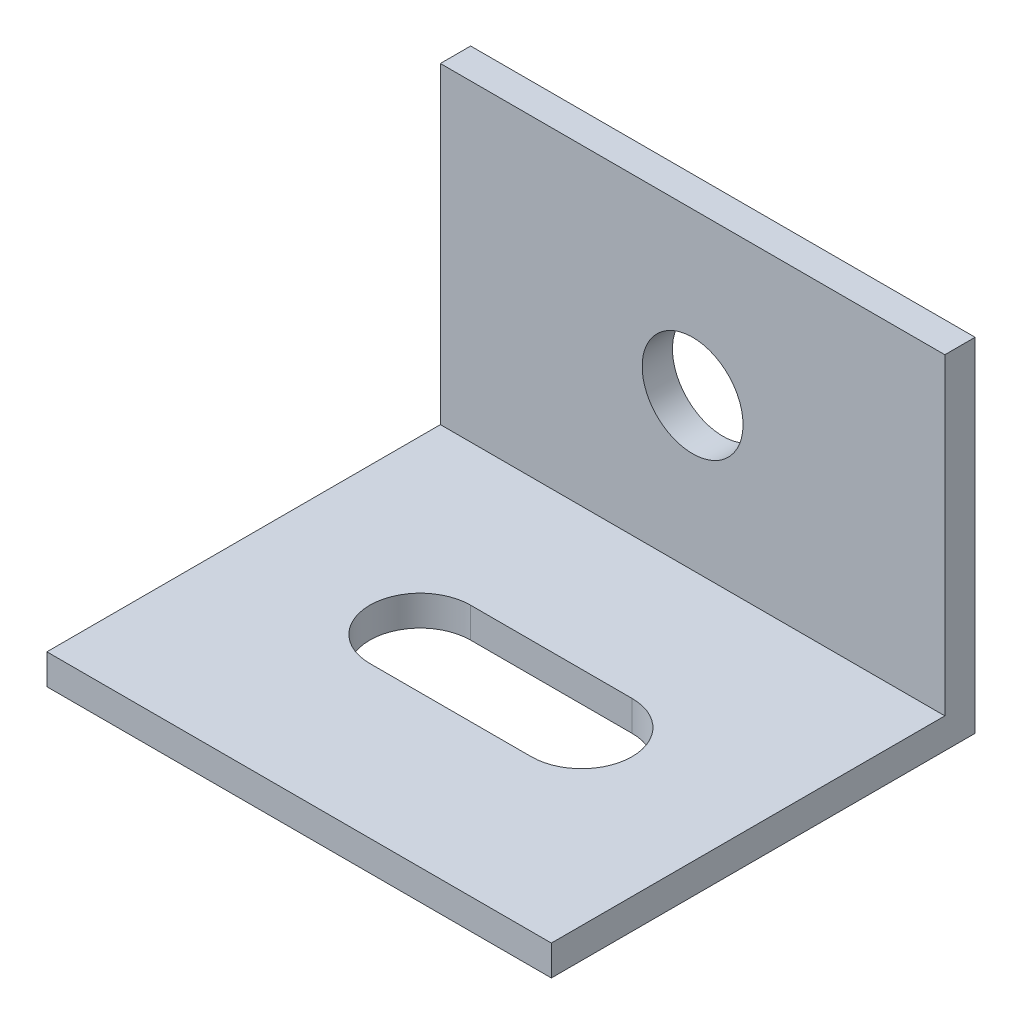
ISO-10303-21;
HEADER;
FILE_DESCRIPTION(('STEP AP214'),'2;1');
FILE_NAME('part.step','',(''),(''),'','','');
FILE_SCHEMA(('AUTOMOTIVE_DESIGN { 1 0 10303 214 1 1 1 1 }'));
ENDSEC;
DATA;
#1=APPLICATION_CONTEXT('core data for automotive mechanical design processes');
#2=APPLICATION_PROTOCOL_DEFINITION('international standard','automotive_design',2000,#1);
#3=PRODUCT_CONTEXT('',#1,'mechanical');
#4=PRODUCT('Part','Part','',(#3));
#5=PRODUCT_RELATED_PRODUCT_CATEGORY('part','',(#4));
#6=PRODUCT_DEFINITION_FORMATION('','',#4);
#7=PRODUCT_DEFINITION_CONTEXT('part definition',#1,'design');
#8=PRODUCT_DEFINITION('design','',#6,#7);
#9=PRODUCT_DEFINITION_SHAPE('','',#8);
#10=(LENGTH_UNIT() NAMED_UNIT(*) SI_UNIT(.MILLI.,.METRE.));
#11=(NAMED_UNIT(*) PLANE_ANGLE_UNIT() SI_UNIT($,.RADIAN.));
#12=(NAMED_UNIT(*) SI_UNIT($,.STERADIAN.) SOLID_ANGLE_UNIT());
#13=UNCERTAINTY_MEASURE_WITH_UNIT(LENGTH_MEASURE(1.E-05),#10,'distance_accuracy_value','');
#14=(GEOMETRIC_REPRESENTATION_CONTEXT(3) GLOBAL_UNCERTAINTY_ASSIGNED_CONTEXT((#13)) GLOBAL_UNIT_ASSIGNED_CONTEXT((#10,
#11,#12)) REPRESENTATION_CONTEXT('',''));
#15=CARTESIAN_POINT('',(0.,0.,0.));
#16=DIRECTION('',(0.,0.,1.));
#17=DIRECTION('',(1.,0.,0.));
#18=AXIS2_PLACEMENT_3D('',#15,#16,#17);
#19=CARTESIAN_POINT('',(0.,0.,1.5));
#20=DIRECTION('',(0.,0.,-1.));
#21=DIRECTION('',(-1.,0.,0.));
#22=AXIS2_PLACEMENT_3D('',#19,#20,#21);
#23=PLANE('',#22);
#24=CARTESIAN_POINT('',(12.5,9.,1.5));
#25=DIRECTION('',(0.,0.,1.));
#26=DIRECTION('',(1.,0.,0.));
#27=AXIS2_PLACEMENT_3D('',#24,#25,#26);
#28=CIRCLE('',#27,2.5);
#29=CARTESIAN_POINT('',(15.,9.,1.5));
#30=VERTEX_POINT('',#29);
#31=EDGE_CURVE('E167',#30,#30,#28,.T.);
#32=ORIENTED_EDGE('',*,*,#31,.F.);
#33=EDGE_LOOP('',(#32));
#34=FACE_BOUND('',#33,.T.);
#35=DIRECTION('',(-1.,0.,0.));
#36=VECTOR('',#35,1.);
#37=CARTESIAN_POINT('',(0.,1.5,1.5));
#38=LINE('',#37,#36);
#39=CARTESIAN_POINT('',(25.,1.5,1.5));
#40=VERTEX_POINT('',#39);
#41=CARTESIAN_POINT('',(0.,1.5,1.5));
#42=VERTEX_POINT('',#41);
#43=EDGE_CURVE('E147',#40,#42,#38,.T.);
#44=ORIENTED_EDGE('',*,*,#43,.F.);
#45=DIRECTION('',(0.,1.,0.));
#46=VECTOR('',#45,1.);
#47=CARTESIAN_POINT('',(25.,0.,1.5));
#48=LINE('',#47,#46);
#49=CARTESIAN_POINT('',(25.,17.,1.5));
#50=VERTEX_POINT('',#49);
#51=EDGE_CURVE('E175',#40,#50,#48,.T.);
#52=ORIENTED_EDGE('',*,*,#51,.T.);
#53=DIRECTION('',(-1.,0.,0.));
#54=VECTOR('',#53,1.);
#55=CARTESIAN_POINT('',(0.,17.,1.5));
#56=LINE('',#55,#54);
#57=CARTESIAN_POINT('',(0.,17.,1.5));
#58=VERTEX_POINT('',#57);
#59=EDGE_CURVE('E178',#50,#58,#56,.T.);
#60=ORIENTED_EDGE('',*,*,#59,.T.);
#61=DIRECTION('',(0.,-1.,0.));
#62=VECTOR('',#61,1.);
#63=CARTESIAN_POINT('',(0.,0.,1.5));
#64=LINE('',#63,#62);
#65=EDGE_CURVE('E173',#58,#42,#64,.T.);
#66=ORIENTED_EDGE('',*,*,#65,.T.);
#67=EDGE_LOOP('',(#44,#52,#60,#66));
#68=FACE_BOUND('',#67,.T.);
#69=ADVANCED_FACE('F33',(#34,#68),#23,.F.);
#70=CARTESIAN_POINT('',(0.,0.,0.));
#71=DIRECTION('',(0.,0.,-1.));
#72=DIRECTION('',(-1.,0.,0.));
#73=AXIS2_PLACEMENT_3D('',#70,#71,#72);
#74=PLANE('',#73);
#75=DIRECTION('',(0.,-1.,0.));
#76=VECTOR('',#75,1.);
#77=CARTESIAN_POINT('',(0.,0.,0.));
#78=LINE('',#77,#76);
#79=CARTESIAN_POINT('',(0.,17.,0.));
#80=VERTEX_POINT('',#79);
#81=CARTESIAN_POINT('',(0.,0.,0.));
#82=VERTEX_POINT('',#81);
#83=EDGE_CURVE('E170',#80,#82,#78,.T.);
#84=ORIENTED_EDGE('',*,*,#83,.F.);
#85=DIRECTION('',(-1.,0.,0.));
#86=VECTOR('',#85,1.);
#87=CARTESIAN_POINT('',(0.,17.,0.));
#88=LINE('',#87,#86);
#89=CARTESIAN_POINT('',(25.,17.,0.));
#90=VERTEX_POINT('',#89);
#91=EDGE_CURVE('E176',#90,#80,#88,.T.);
#92=ORIENTED_EDGE('',*,*,#91,.F.);
#93=DIRECTION('',(0.,1.,0.));
#94=VECTOR('',#93,1.);
#95=CARTESIAN_POINT('',(25.,0.,0.));
#96=LINE('',#95,#94);
#97=CARTESIAN_POINT('',(25.,0.,0.));
#98=VERTEX_POINT('',#97);
#99=EDGE_CURVE('E185',#98,#90,#96,.T.);
#100=ORIENTED_EDGE('',*,*,#99,.F.);
#101=DIRECTION('',(1.,0.,0.));
#102=VECTOR('',#101,1.);
#103=CARTESIAN_POINT('',(0.,0.,0.));
#104=LINE('',#103,#102);
#105=EDGE_CURVE('E183',#82,#98,#104,.T.);
#106=ORIENTED_EDGE('',*,*,#105,.F.);
#107=EDGE_LOOP('',(#84,#92,#100,#106));
#108=FACE_BOUND('',#107,.T.);
#109=CARTESIAN_POINT('',(12.5,9.,0.));
#110=DIRECTION('',(0.,0.,1.));
#111=DIRECTION('',(1.,0.,0.));
#112=AXIS2_PLACEMENT_3D('',#109,#110,#111);
#113=CIRCLE('',#112,2.5);
#114=CARTESIAN_POINT('',(15.,9.,0.));
#115=VERTEX_POINT('',#114);
#116=EDGE_CURVE('E166',#115,#115,#113,.T.);
#117=ORIENTED_EDGE('',*,*,#116,.T.);
#118=EDGE_LOOP('',(#117));
#119=FACE_BOUND('',#118,.T.);
#120=ADVANCED_FACE('F204',(#108,#119),#74,.T.);
#121=CARTESIAN_POINT('',(0.,0.,1.5));
#122=DIRECTION('',(1.,0.,0.));
#123=DIRECTION('',(0.,0.,-1.));
#124=AXIS2_PLACEMENT_3D('',#121,#122,#123);
#125=PLANE('',#124);
#126=ORIENTED_EDGE('',*,*,#83,.T.);
#127=DIRECTION('',(0.,0.,-1.));
#128=VECTOR('',#127,1.);
#129=CARTESIAN_POINT('',(0.,0.,1.5));
#130=LINE('',#129,#128);
#131=CARTESIAN_POINT('',(0.,0.,21.));
#132=VERTEX_POINT('',#131);
#133=EDGE_CURVE('E11',#132,#82,#130,.T.);
#134=ORIENTED_EDGE('',*,*,#133,.F.);
#135=DIRECTION('',(0.,-1.,0.));
#136=VECTOR('',#135,1.);
#137=CARTESIAN_POINT('',(0.,0.,21.));
#138=LINE('',#137,#136);
#139=CARTESIAN_POINT('',(0.,1.5,21.));
#140=VERTEX_POINT('',#139);
#141=EDGE_CURVE('E148',#140,#132,#138,.T.);
#142=ORIENTED_EDGE('',*,*,#141,.F.);
#143=DIRECTION('',(0.,0.,-1.));
#144=VECTOR('',#143,1.);
#145=CARTESIAN_POINT('',(0.,1.5,21.));
#146=LINE('',#145,#144);
#147=EDGE_CURVE('E158',#140,#42,#146,.T.);
#148=ORIENTED_EDGE('',*,*,#147,.T.);
#149=ORIENTED_EDGE('',*,*,#65,.F.);
#150=DIRECTION('',(0.,0.,-1.));
#151=VECTOR('',#150,1.);
#152=CARTESIAN_POINT('',(0.,17.,1.5));
#153=LINE('',#152,#151);
#154=EDGE_CURVE('E180',#58,#80,#153,.T.);
#155=ORIENTED_EDGE('',*,*,#154,.T.);
#156=EDGE_LOOP('',(#126,#134,#142,#148,#149,#155));
#157=FACE_BOUND('',#156,.T.);
#158=ADVANCED_FACE('F35',(#157),#125,.F.);
#159=CARTESIAN_POINT('',(0.,0.,1.5));
#160=DIRECTION('',(0.,1.,0.));
#161=DIRECTION('',(0.,0.,1.));
#162=AXIS2_PLACEMENT_3D('',#159,#160,#161);
#163=PLANE('',#162);
#164=DIRECTION('',(-1.,0.,0.));
#165=VECTOR('',#164,1.);
#166=CARTESIAN_POINT('',(0.,0.,8.5));
#167=LINE('',#166,#165);
#168=CARTESIAN_POINT('',(16.5,0.,8.5));
#169=VERTEX_POINT('',#168);
#170=CARTESIAN_POINT('',(8.5,0.,8.5));
#171=VERTEX_POINT('',#170);
#172=EDGE_CURVE('E141',#169,#171,#167,.T.);
#173=ORIENTED_EDGE('',*,*,#172,.T.);
#174=CARTESIAN_POINT('',(8.5,0.,11.));
#175=DIRECTION('',(0.,1.,0.));
#176=DIRECTION('',(0.,0.,1.));
#177=AXIS2_PLACEMENT_3D('',#174,#175,#176);
#178=CIRCLE('',#177,2.5);
#179=CARTESIAN_POINT('',(8.5,0.,13.5));
#180=VERTEX_POINT('',#179);
#181=EDGE_CURVE('E144',#171,#180,#178,.T.);
#182=ORIENTED_EDGE('',*,*,#181,.T.);
#183=DIRECTION('',(1.,0.,0.));
#184=VECTOR('',#183,1.);
#185=CARTESIAN_POINT('',(0.,0.,13.5));
#186=LINE('',#185,#184);
#187=CARTESIAN_POINT('',(16.5,0.,13.5));
#188=VERTEX_POINT('',#187);
#189=EDGE_CURVE('E136',#180,#188,#186,.T.);
#190=ORIENTED_EDGE('',*,*,#189,.T.);
#191=CARTESIAN_POINT('',(16.5,0.,11.));
#192=DIRECTION('',(0.,1.,0.));
#193=DIRECTION('',(0.,0.,1.));
#194=AXIS2_PLACEMENT_3D('',#191,#192,#193);
#195=CIRCLE('',#194,2.5);
#196=EDGE_CURVE('E116',#188,#169,#195,.T.);
#197=ORIENTED_EDGE('',*,*,#196,.T.);
#198=EDGE_LOOP('',(#173,#182,#190,#197));
#199=FACE_BOUND('',#198,.T.);
#200=ORIENTED_EDGE('',*,*,#105,.T.);
#201=DIRECTION('',(0.,0.,-1.));
#202=VECTOR('',#201,1.);
#203=CARTESIAN_POINT('',(25.,0.,1.5));
#204=LINE('',#203,#202);
#205=CARTESIAN_POINT('',(25.,0.,21.));
#206=VERTEX_POINT('',#205);
#207=EDGE_CURVE('E41',#206,#98,#204,.T.);
#208=ORIENTED_EDGE('',*,*,#207,.F.);
#209=DIRECTION('',(1.,0.,0.));
#210=VECTOR('',#209,1.);
#211=CARTESIAN_POINT('',(0.,0.,21.));
#212=LINE('',#211,#210);
#213=EDGE_CURVE('E151',#132,#206,#212,.T.);
#214=ORIENTED_EDGE('',*,*,#213,.F.);
#215=ORIENTED_EDGE('',*,*,#133,.T.);
#216=EDGE_LOOP('',(#200,#208,#214,#215));
#217=FACE_BOUND('',#216,.T.);
#218=ADVANCED_FACE('F219',(#199,#217),#163,.F.);
#219=CARTESIAN_POINT('',(25.,0.,1.5));
#220=DIRECTION('',(-1.,0.,0.));
#221=DIRECTION('',(0.,0.,1.));
#222=AXIS2_PLACEMENT_3D('',#219,#220,#221);
#223=PLANE('',#222);
#224=ORIENTED_EDGE('',*,*,#99,.T.);
#225=DIRECTION('',(0.,0.,-1.));
#226=VECTOR('',#225,1.);
#227=CARTESIAN_POINT('',(25.,17.,1.5));
#228=LINE('',#227,#226);
#229=EDGE_CURVE('E190',#50,#90,#228,.T.);
#230=ORIENTED_EDGE('',*,*,#229,.F.);
#231=ORIENTED_EDGE('',*,*,#51,.F.);
#232=DIRECTION('',(0.,0.,-1.));
#233=VECTOR('',#232,1.);
#234=CARTESIAN_POINT('',(25.,1.5,21.));
#235=LINE('',#234,#233);
#236=CARTESIAN_POINT('',(25.,1.5,21.));
#237=VERTEX_POINT('',#236);
#238=EDGE_CURVE('E163',#237,#40,#235,.T.);
#239=ORIENTED_EDGE('',*,*,#238,.F.);
#240=DIRECTION('',(0.,1.,0.));
#241=VECTOR('',#240,1.);
#242=CARTESIAN_POINT('',(25.,0.,21.));
#243=LINE('',#242,#241);
#244=EDGE_CURVE('E154',#206,#237,#243,.T.);
#245=ORIENTED_EDGE('',*,*,#244,.F.);
#246=ORIENTED_EDGE('',*,*,#207,.T.);
#247=EDGE_LOOP('',(#224,#230,#231,#239,#245,#246));
#248=FACE_BOUND('',#247,.T.);
#249=ADVANCED_FACE('F196',(#248),#223,.F.);
#250=CARTESIAN_POINT('',(0.,17.,1.5));
#251=DIRECTION('',(0.,-1.,0.));
#252=DIRECTION('',(0.,0.,-1.));
#253=AXIS2_PLACEMENT_3D('',#250,#251,#252);
#254=PLANE('',#253);
#255=ORIENTED_EDGE('',*,*,#91,.T.);
#256=ORIENTED_EDGE('',*,*,#154,.F.);
#257=ORIENTED_EDGE('',*,*,#59,.F.);
#258=ORIENTED_EDGE('',*,*,#229,.T.);
#259=EDGE_LOOP('',(#255,#256,#257,#258));
#260=FACE_BOUND('',#259,.T.);
#261=ADVANCED_FACE('F208',(#260),#254,.F.);
#262=CARTESIAN_POINT('',(12.5,9.,1.5));
#263=DIRECTION('',(0.,0.,-1.));
#264=DIRECTION('',(-1.,0.,0.));
#265=AXIS2_PLACEMENT_3D('',#262,#263,#264);
#266=CYLINDRICAL_SURFACE('',#265,2.5);
#267=ORIENTED_EDGE('',*,*,#31,.T.);
#268=EDGE_LOOP('',(#267));
#269=FACE_BOUND('',#268,.T.);
#270=ORIENTED_EDGE('',*,*,#116,.F.);
#271=EDGE_LOOP('',(#270));
#272=FACE_BOUND('',#271,.T.);
#273=ADVANCED_FACE('F236',(#269,#272),#266,.F.);
#274=CARTESIAN_POINT('',(0.,1.5,21.));
#275=DIRECTION('',(0.,-1.,0.));
#276=DIRECTION('',(0.,0.,-1.));
#277=AXIS2_PLACEMENT_3D('',#274,#275,#276);
#278=PLANE('',#277);
#279=DIRECTION('',(1.,0.,0.));
#280=VECTOR('',#279,1.);
#281=CARTESIAN_POINT('',(8.5,1.5,13.5));
#282=LINE('',#281,#280);
#283=CARTESIAN_POINT('',(8.5,1.5,13.5));
#284=VERTEX_POINT('',#283);
#285=CARTESIAN_POINT('',(16.5,1.5,13.5));
#286=VERTEX_POINT('',#285);
#287=EDGE_CURVE('E122',#284,#286,#282,.T.);
#288=ORIENTED_EDGE('',*,*,#287,.F.);
#289=CARTESIAN_POINT('',(8.5,1.5,11.));
#290=DIRECTION('',(0.,1.,0.));
#291=DIRECTION('',(0.,0.,1.));
#292=AXIS2_PLACEMENT_3D('',#289,#290,#291);
#293=CIRCLE('',#292,2.5);
#294=CARTESIAN_POINT('',(8.5,1.5,8.5));
#295=VERTEX_POINT('',#294);
#296=EDGE_CURVE('E56',#295,#284,#293,.T.);
#297=ORIENTED_EDGE('',*,*,#296,.F.);
#298=DIRECTION('',(-1.,0.,0.));
#299=VECTOR('',#298,1.);
#300=CARTESIAN_POINT('',(8.5,1.5,8.5));
#301=LINE('',#300,#299);
#302=CARTESIAN_POINT('',(16.5,1.5,8.5));
#303=VERTEX_POINT('',#302);
#304=EDGE_CURVE('E129',#303,#295,#301,.T.);
#305=ORIENTED_EDGE('',*,*,#304,.F.);
#306=CARTESIAN_POINT('',(16.5,1.5,11.));
#307=DIRECTION('',(0.,1.,0.));
#308=DIRECTION('',(0.,0.,1.));
#309=AXIS2_PLACEMENT_3D('',#306,#307,#308);
#310=CIRCLE('',#309,2.5);
#311=EDGE_CURVE('E113',#286,#303,#310,.T.);
#312=ORIENTED_EDGE('',*,*,#311,.F.);
#313=EDGE_LOOP('',(#288,#297,#305,#312));
#314=FACE_BOUND('',#313,.T.);
#315=ORIENTED_EDGE('',*,*,#43,.T.);
#316=ORIENTED_EDGE('',*,*,#147,.F.);
#317=DIRECTION('',(-1.,0.,0.));
#318=VECTOR('',#317,1.);
#319=CARTESIAN_POINT('',(0.,1.5,21.));
#320=LINE('',#319,#318);
#321=EDGE_CURVE('E156',#237,#140,#320,.T.);
#322=ORIENTED_EDGE('',*,*,#321,.F.);
#323=ORIENTED_EDGE('',*,*,#238,.T.);
#324=EDGE_LOOP('',(#315,#316,#322,#323));
#325=FACE_BOUND('',#324,.T.);
#326=ADVANCED_FACE('F126',(#314,#325),#278,.F.);
#327=CARTESIAN_POINT('',(0.,0.,21.));
#328=DIRECTION('',(0.,0.,-1.));
#329=DIRECTION('',(-1.,0.,0.));
#330=AXIS2_PLACEMENT_3D('',#327,#328,#329);
#331=PLANE('',#330);
#332=ORIENTED_EDGE('',*,*,#141,.T.);
#333=ORIENTED_EDGE('',*,*,#213,.T.);
#334=ORIENTED_EDGE('',*,*,#244,.T.);
#335=ORIENTED_EDGE('',*,*,#321,.T.);
#336=EDGE_LOOP('',(#332,#333,#334,#335));
#337=FACE_BOUND('',#336,.T.);
#338=ADVANCED_FACE('F218',(#337),#331,.F.);
#339=CARTESIAN_POINT('',(8.5,-18.,11.));
#340=DIRECTION('',(0.,1.,0.));
#341=DIRECTION('',(0.,0.,1.));
#342=AXIS2_PLACEMENT_3D('',#339,#340,#341);
#343=CYLINDRICAL_SURFACE('',#342,2.5);
#344=DIRECTION('',(0.,1.,0.));
#345=VECTOR('',#344,1.);
#346=CARTESIAN_POINT('',(8.5,-18.,8.5));
#347=LINE('',#346,#345);
#348=EDGE_CURVE('E134',#171,#295,#347,.T.);
#349=ORIENTED_EDGE('',*,*,#348,.T.);
#350=ORIENTED_EDGE('',*,*,#296,.T.);
#351=DIRECTION('',(0.,1.,0.));
#352=VECTOR('',#351,1.);
#353=CARTESIAN_POINT('',(8.5,-18.,13.5));
#354=LINE('',#353,#352);
#355=EDGE_CURVE('E119',#180,#284,#354,.T.);
#356=ORIENTED_EDGE('',*,*,#355,.F.);
#357=ORIENTED_EDGE('',*,*,#181,.F.);
#358=EDGE_LOOP('',(#349,#350,#356,#357));
#359=FACE_BOUND('',#358,.T.);
#360=ADVANCED_FACE('F252',(#359),#343,.F.);
#361=CARTESIAN_POINT('',(8.5,-18.,8.5));
#362=DIRECTION('',(0.,0.,-1.));
#363=DIRECTION('',(-1.,0.,0.));
#364=AXIS2_PLACEMENT_3D('',#361,#362,#363);
#365=PLANE('',#364);
#366=DIRECTION('',(0.,1.,0.));
#367=VECTOR('',#366,1.);
#368=CARTESIAN_POINT('',(16.5,-18.,8.5));
#369=LINE('',#368,#367);
#370=EDGE_CURVE('E118',#169,#303,#369,.T.);
#371=ORIENTED_EDGE('',*,*,#370,.T.);
#372=ORIENTED_EDGE('',*,*,#304,.T.);
#373=ORIENTED_EDGE('',*,*,#348,.F.);
#374=ORIENTED_EDGE('',*,*,#172,.F.);
#375=EDGE_LOOP('',(#371,#372,#373,#374));
#376=FACE_BOUND('',#375,.T.);
#377=ADVANCED_FACE('F257',(#376),#365,.F.);
#378=CARTESIAN_POINT('',(16.5,-18.,11.));
#379=DIRECTION('',(0.,1.,0.));
#380=DIRECTION('',(0.,0.,1.));
#381=AXIS2_PLACEMENT_3D('',#378,#379,#380);
#382=CYLINDRICAL_SURFACE('',#381,2.5);
#383=DIRECTION('',(0.,1.,0.));
#384=VECTOR('',#383,1.);
#385=CARTESIAN_POINT('',(16.5,-18.,13.5));
#386=LINE('',#385,#384);
#387=EDGE_CURVE('E48',#188,#286,#386,.T.);
#388=ORIENTED_EDGE('',*,*,#387,.T.);
#389=ORIENTED_EDGE('',*,*,#311,.T.);
#390=ORIENTED_EDGE('',*,*,#370,.F.);
#391=ORIENTED_EDGE('',*,*,#196,.F.);
#392=EDGE_LOOP('',(#388,#389,#390,#391));
#393=FACE_BOUND('',#392,.T.);
#394=ADVANCED_FACE('F110',(#393),#382,.F.);
#395=CARTESIAN_POINT('',(8.5,-18.,13.5));
#396=DIRECTION('',(0.,0.,1.));
#397=DIRECTION('',(1.,0.,0.));
#398=AXIS2_PLACEMENT_3D('',#395,#396,#397);
#399=PLANE('',#398);
#400=ORIENTED_EDGE('',*,*,#355,.T.);
#401=ORIENTED_EDGE('',*,*,#287,.T.);
#402=ORIENTED_EDGE('',*,*,#387,.F.);
#403=ORIENTED_EDGE('',*,*,#189,.F.);
#404=EDGE_LOOP('',(#400,#401,#402,#403));
#405=FACE_BOUND('',#404,.T.);
#406=ADVANCED_FACE('F123',(#405),#399,.F.);
#407=CLOSED_SHELL('',(#69,#120,#158,#218,#249,#261,#273,#326,#338,#360,#377,#394,#406));
#408=MANIFOLD_SOLID_BREP('B2',#407);
#409=ADVANCED_BREP_SHAPE_REPRESENTATION('',(#18,#408),#14);
#410=SHAPE_DEFINITION_REPRESENTATION(#9,#409);
ENDSEC;
END-ISO-10303-21;
